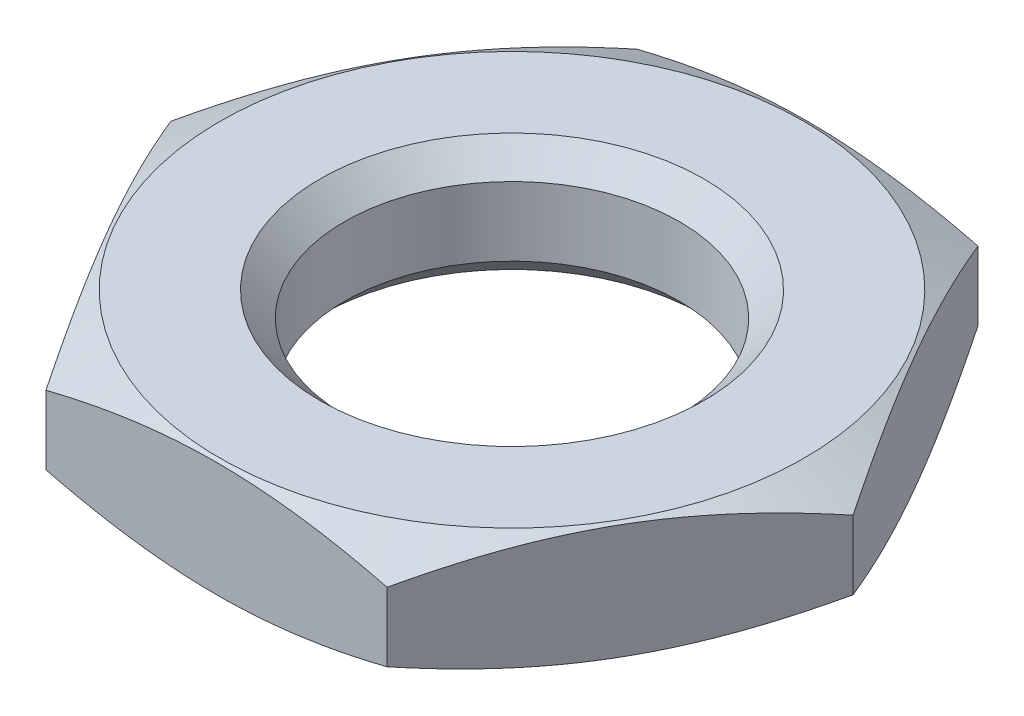
ISO-10303-21;
HEADER;
FILE_DESCRIPTION(('STEP AP214'),'2;1');
FILE_NAME('part.step','',(''),(''),'','','');
FILE_SCHEMA(('AUTOMOTIVE_DESIGN { 1 0 10303 214 1 1 1 1 }'));
ENDSEC;
DATA;
#1=APPLICATION_CONTEXT('core data for automotive mechanical design processes');
#2=APPLICATION_PROTOCOL_DEFINITION('international standard','automotive_design',2000,#1);
#3=PRODUCT_CONTEXT('',#1,'mechanical');
#4=PRODUCT('Part','Part','',(#3));
#5=PRODUCT_RELATED_PRODUCT_CATEGORY('part','',(#4));
#6=PRODUCT_DEFINITION_FORMATION('','',#4);
#7=PRODUCT_DEFINITION_CONTEXT('part definition',#1,'design');
#8=PRODUCT_DEFINITION('design','',#6,#7);
#9=PRODUCT_DEFINITION_SHAPE('','',#8);
#10=(LENGTH_UNIT() NAMED_UNIT(*) SI_UNIT(.MILLI.,.METRE.));
#11=(NAMED_UNIT(*) PLANE_ANGLE_UNIT() SI_UNIT($,.RADIAN.));
#12=(NAMED_UNIT(*) SI_UNIT($,.STERADIAN.) SOLID_ANGLE_UNIT());
#13=UNCERTAINTY_MEASURE_WITH_UNIT(LENGTH_MEASURE(1.E-05),#10,'distance_accuracy_value','');
#14=(GEOMETRIC_REPRESENTATION_CONTEXT(3) GLOBAL_UNCERTAINTY_ASSIGNED_CONTEXT((#13)) GLOBAL_UNIT_ASSIGNED_CONTEXT((#10,
#11,#12)) REPRESENTATION_CONTEXT('',''));
#15=CARTESIAN_POINT('',(0.,0.,0.));
#16=DIRECTION('',(0.,0.,1.));
#17=DIRECTION('',(1.,0.,0.));
#18=AXIS2_PLACEMENT_3D('',#15,#16,#17);
#19=CARTESIAN_POINT('',(0.,1.2,0.));
#20=DIRECTION('',(0.,1.,0.));
#21=DIRECTION('',(0.,0.,1.));
#22=AXIS2_PLACEMENT_3D('',#19,#20,#21);
#23=PLANE('',#22);
#24=CARTESIAN_POINT('',(0.,1.2,0.));
#25=DIRECTION('',(0.,1.,0.));
#26=DIRECTION('',(0.,0.,1.));
#27=AXIS2_PLACEMENT_3D('',#24,#25,#26);
#28=CIRCLE('',#27,3.9);
#29=CARTESIAN_POINT('',(0.,1.2,3.9));
#30=VERTEX_POINT('',#29);
#31=EDGE_CURVE('E142',#30,#30,#28,.F.);
#32=ORIENTED_EDGE('',*,*,#31,.T.);
#33=EDGE_LOOP('',(#32));
#34=FACE_BOUND('',#33,.T.);
#35=CARTESIAN_POINT('',(0.,1.2,0.));
#36=DIRECTION('',(0.,-1.,0.));
#37=DIRECTION('',(0.,0.,-1.));
#38=AXIS2_PLACEMENT_3D('',#35,#36,#37);
#39=CIRCLE('',#38,5.92820323027551);
#40=CARTESIAN_POINT('',(0.,1.2,-5.92820323027551));
#41=VERTEX_POINT('',#40);
#42=EDGE_CURVE('E250',#41,#41,#39,.T.);
#43=ORIENTED_EDGE('',*,*,#42,.F.);
#44=EDGE_LOOP('',(#43));
#45=FACE_BOUND('',#44,.T.);
#46=ADVANCED_FACE('F41',(#34,#45),#23,.T.);
#47=CARTESIAN_POINT('',(0.,-1.2,0.));
#48=DIRECTION('',(0.,1.,0.));
#49=DIRECTION('',(0.,0.,1.));
#50=AXIS2_PLACEMENT_3D('',#47,#48,#49);
#51=PLANE('',#50);
#52=CARTESIAN_POINT('',(0.,-1.2,0.));
#53=DIRECTION('',(0.,-1.,0.));
#54=DIRECTION('',(0.,0.,-1.));
#55=AXIS2_PLACEMENT_3D('',#52,#53,#54);
#56=CIRCLE('',#55,5.92820323027551);
#57=CARTESIAN_POINT('',(0.,-1.2,-5.92820323027551));
#58=VERTEX_POINT('',#57);
#59=EDGE_CURVE('E255',#58,#58,#56,.T.);
#60=ORIENTED_EDGE('',*,*,#59,.T.);
#61=EDGE_LOOP('',(#60));
#62=FACE_BOUND('',#61,.T.);
#63=CARTESIAN_POINT('',(0.,-1.2,0.));
#64=DIRECTION('',(0.,1.,0.));
#65=DIRECTION('',(0.,0.,1.));
#66=AXIS2_PLACEMENT_3D('',#63,#64,#65);
#67=CIRCLE('',#66,3.9);
#68=CARTESIAN_POINT('',(0.,-1.2,3.9));
#69=VERTEX_POINT('',#68);
#70=EDGE_CURVE('E123',#69,#69,#67,.T.);
#71=ORIENTED_EDGE('',*,*,#70,.T.);
#72=EDGE_LOOP('',(#71));
#73=FACE_BOUND('',#72,.T.);
#74=ADVANCED_FACE('F263',(#62,#73),#51,.F.);
#75=CARTESIAN_POINT('',(0.,1.2,0.));
#76=DIRECTION('',(0.,-1.,0.));
#77=DIRECTION('',(0.,0.,-1.));
#78=AXIS2_PLACEMENT_3D('',#75,#76,#77);
#79=CYLINDRICAL_SURFACE('',#78,3.4);
#80=CARTESIAN_POINT('',(0.,-0.7,0.));
#81=DIRECTION('',(0.,1.,0.));
#82=DIRECTION('',(0.,0.,1.));
#83=AXIS2_PLACEMENT_3D('',#80,#81,#82);
#84=CIRCLE('',#83,3.4);
#85=CARTESIAN_POINT('',(0.,-0.7,3.4));
#86=VERTEX_POINT('',#85);
#87=EDGE_CURVE('E138',#86,#86,#84,.F.);
#88=ORIENTED_EDGE('',*,*,#87,.T.);
#89=EDGE_LOOP('',(#88));
#90=FACE_BOUND('',#89,.T.);
#91=CARTESIAN_POINT('',(0.,0.699999999999999,0.));
#92=DIRECTION('',(0.,1.,0.));
#93=DIRECTION('',(0.,0.,1.));
#94=AXIS2_PLACEMENT_3D('',#91,#92,#93);
#95=CIRCLE('',#94,3.4);
#96=CARTESIAN_POINT('',(0.,0.699999999999999,3.4));
#97=VERTEX_POINT('',#96);
#98=EDGE_CURVE('E129',#97,#97,#95,.T.);
#99=ORIENTED_EDGE('',*,*,#98,.T.);
#100=EDGE_LOOP('',(#99));
#101=FACE_BOUND('',#100,.T.);
#102=ADVANCED_FACE('F161',(#90,#101),#79,.F.);
#103=CARTESIAN_POINT('',(0.,-1.2,0.));
#104=DIRECTION('',(0.,-1.,0.));
#105=DIRECTION('',(0.,0.,-1.));
#106=AXIS2_PLACEMENT_3D('',#103,#104,#105);
#107=CONICAL_SURFACE('',#106,3.9,0.785398163397446);
#108=ORIENTED_EDGE('',*,*,#87,.F.);
#109=EDGE_LOOP('',(#108));
#110=FACE_BOUND('',#109,.T.);
#111=ORIENTED_EDGE('',*,*,#70,.F.);
#112=EDGE_LOOP('',(#111));
#113=FACE_BOUND('',#112,.T.);
#114=ADVANCED_FACE('F268',(#110,#113),#107,.F.);
#115=CARTESIAN_POINT('',(0.,0.699999999999999,0.));
#116=DIRECTION('',(0.,1.,0.));
#117=DIRECTION('',(0.,0.,1.));
#118=AXIS2_PLACEMENT_3D('',#115,#116,#117);
#119=CONICAL_SURFACE('',#118,3.4,0.78539816339745);
#120=ORIENTED_EDGE('',*,*,#31,.F.);
#121=EDGE_LOOP('',(#120));
#122=FACE_BOUND('',#121,.T.);
#123=ORIENTED_EDGE('',*,*,#98,.F.);
#124=EDGE_LOOP('',(#123));
#125=FACE_BOUND('',#124,.T.);
#126=ADVANCED_FACE('F44',(#122,#125),#119,.F.);
#127=CARTESIAN_POINT('',(0.,-0.7,0.));
#128=DIRECTION('',(0.,1.,0.));
#129=DIRECTION('',(0.,0.,1.));
#130=AXIS2_PLACEMENT_3D('',#127,#128,#129);
#131=CONICAL_SURFACE('',#130,6.92820323027551,1.10714871779409);
#132=ORIENTED_EDGE('',*,*,#59,.F.);
#133=EDGE_LOOP('',(#132));
#134=FACE_BOUND('',#133,.T.);
#135=CARTESIAN_POINT('',(3.46398614508392,-0.699942263529729,6.0002));
#136=CARTESIAN_POINT('',(3.56162244786315,-0.748759243221176,5.83108896292318));
#137=CARTESIAN_POINT('',(3.65963913365284,-0.794679237030984,5.66131908314594));
#138=CARTESIAN_POINT('',(3.85645321453345,-0.879758268314605,5.32042709541575));
#139=CARTESIAN_POINT('',(3.95525098446174,-0.918913824047387,5.14930433822545));
#140=CARTESIAN_POINT('',(4.15369366564409,-0.989497059101713,4.80559153202743));
#141=CARTESIAN_POINT('',(4.25333961439506,-1.02091321349939,4.63299968602234));
#142=CARTESIAN_POINT('',(4.45321302199466,-1.07497419451463,4.28680878897791));
#143=CARTESIAN_POINT('',(4.55344037758671,-1.09762053298107,4.11320991678421));
#144=CARTESIAN_POINT('',(4.7520474389595,-1.1329465904084,3.76921239574458));
#145=CARTESIAN_POINT('',(4.85041751638308,-1.14584063008244,3.59883042370247));
#146=CARTESIAN_POINT('',(5.04736245260459,-1.16201752257452,3.25771178787339));
#147=CARTESIAN_POINT('',(5.14593732126247,-1.16529990136738,3.08697510700851));
#148=CARTESIAN_POINT('',(5.34294096418315,-1.16212617764838,2.74575478819375));
#149=CARTESIAN_POINT('',(5.44136978140928,-1.15568056561566,2.57527107582918));
#150=CARTESIAN_POINT('',(5.63794689713362,-1.13331863936492,2.23478952378927));
#151=CARTESIAN_POINT('',(5.73609521883008,-1.11740313254859,2.06479164393339));
#152=CARTESIAN_POINT('',(5.92576492800627,-1.0779593915224,1.73627407098341));
#153=CARTESIAN_POINT('',(6.01731488892831,-1.05497287488125,1.57770488723549));
#154=CARTESIAN_POINT('',(6.19990052050558,-1.00184306357037,1.26145729661161));
#155=CARTESIAN_POINT('',(6.29093613521713,-0.971699005177491,1.10377898663294));
#156=CARTESIAN_POINT('',(6.47342458540408,-0.904632551665562,0.787699719114637));
#157=CARTESIAN_POINT('',(6.56487075312607,-0.867638318144482,0.629310310462681));
#158=CARTESIAN_POINT('',(6.74709206818538,-0.787904072048137,0.313693734557949));
#159=CARTESIAN_POINT('',(6.83786750847436,-0.745166746166823,0.156466059898004));
#160=CARTESIAN_POINT('',(6.92831870032935,-0.699942263529729,-0.000200000000002981));
#161=B_SPLINE_CURVE_WITH_KNOTS('',3,(#135,#136,#137,#138,#139,#140,#141,#142,#143,#144,#145,
#146,#147,#148,#149,#150,#151,#152,#153,#154,#155,#156,#157,#158,#159,#160),.UNSPECIFIED.,.F.,
.F.,(4,2,2,2,2,2,2,2,2,2,2,2,4),(0.,0.603877187154902,1.20806427734942,1.81314571082424,
2.41812278642384,3.00938394511973,3.6006742629755,4.19132740011025,4.78193018546964,
5.33538966110918,5.88890821847391,6.44859919055235,7.00802923747474),.UNSPECIFIED.);
#162=CARTESIAN_POINT('',(3.46410161513776,-0.7,6.));
#163=VERTEX_POINT('',#162);
#164=CARTESIAN_POINT('',(6.92820323027551,-0.7,0.));
#165=VERTEX_POINT('',#164);
#166=EDGE_CURVE('E57',#163,#165,#161,.T.);
#167=ORIENTED_EDGE('',*,*,#166,.F.);
#168=CARTESIAN_POINT('',(-10.4105236098626,1.84378906777891,6.));
#169=CARTESIAN_POINT('',(-10.1167501837905,1.71655851512729,6.));
#170=CARTESIAN_POINT('',(-9.82250362945565,1.59040339163447,6.));
#171=CARTESIAN_POINT('',(-9.23279428985534,1.34088247274867,6.));
#172=CARTESIAN_POINT('',(-8.93733137784915,1.21751697719187,6.));
#173=CARTESIAN_POINT('',(-8.34404044199719,0.973854548708385,6.));
#174=CARTESIAN_POINT('',(-8.0462078852258,0.853568619026698,6.));
#175=CARTESIAN_POINT('',(-7.4488058376684,0.617404777751302,6.));
#176=CARTESIAN_POINT('',(-7.14923640297822,0.501526724700586,6.));
#177=CARTESIAN_POINT('',(-6.54814947750954,0.27546608855027,6.));
#178=CARTESIAN_POINT('',(-6.24663325328858,0.165280154271951,6.));
#179=CARTESIAN_POINT('',(-5.64100983374639,-0.0478327559760857,6.));
#180=CARTESIAN_POINT('',(-5.33690246704186,-0.150759247548418,6.));
#181=CARTESIAN_POINT('',(-4.72584675810012,-0.347071674826102,6.));
#182=CARTESIAN_POINT('',(-4.4189007967457,-0.440464932649821,6.));
#183=CARTESIAN_POINT('',(-3.80156617952493,-0.614910833013959,6.));
#184=CARTESIAN_POINT('',(-3.49117809053154,-0.695965476109179,6.));
#185=CARTESIAN_POINT('',(-2.76326569496856,-0.866331969641643,6.));
#186=CARTESIAN_POINT('',(-2.34423279594421,-0.949520984034137,6.));
#187=CARTESIAN_POINT('',(-1.7115549227716,-1.04604643279429,6.));
#188=CARTESIAN_POINT('',(-1.50003978477157,-1.07350780487205,6.));
#189=CARTESIAN_POINT('',(-1.0758980597364,-1.11801359038784,6.));
#190=CARTESIAN_POINT('',(-0.863271495665072,-1.13505821820091,6.));
#191=CARTESIAN_POINT('',(-0.437704422216154,-1.15798680726255,6.));
#192=CARTESIAN_POINT('',(-0.22476474616125,-1.16388607788367,6.));
#193=CARTESIAN_POINT('',(0.201124781346108,-1.16430550973797,6.));
#194=CARTESIAN_POINT('',(0.414074632723999,-1.15882574443061,6.));
#195=CARTESIAN_POINT('',(0.839455006139961,-1.13673013055748,6.));
#196=CARTESIAN_POINT('',(1.05188534783239,-1.12011084933067,6.));
#197=CARTESIAN_POINT('',(1.47565974071063,-1.07644325181762,6.));
#198=CARTESIAN_POINT('',(1.68700374785014,-1.04939451598856,6.));
#199=CARTESIAN_POINT('',(2.26427649135521,-0.962350779831864,6.));
#200=CARTESIAN_POINT('',(2.62877144234066,-0.892791670668626,6.));
#201=CARTESIAN_POINT('',(3.3527895483382,-0.731325650542965,6.));
#202=CARTESIAN_POINT('',(3.7123101856876,-0.639407831082056,6.));
#203=CARTESIAN_POINT('',(4.42790855353661,-0.438568504757574,6.));
#204=CARTESIAN_POINT('',(4.78396906070162,-0.329586517510285,6.));
#205=CARTESIAN_POINT('',(5.4919747128233,-0.0993284470541044,6.));
#206=CARTESIAN_POINT('',(5.843920548491,0.0219455387187662,6.));
#207=CARTESIAN_POINT('',(6.55242474656248,0.276399620010221,6.));
#208=CARTESIAN_POINT('',(6.90890831526848,0.409786439133047,6.));
#209=CARTESIAN_POINT('',(7.61917487370723,0.683597260902434,6.));
#210=CARTESIAN_POINT('',(7.97295767484324,0.824021749907911,6.));
#211=CARTESIAN_POINT('',(8.67501528558503,1.10880566039688,6.));
#212=CARTESIAN_POINT('',(9.02331048482593,1.25311498659746,6.));
#213=CARTESIAN_POINT('',(9.54444917061347,1.47255927104919,6.));
#214=CARTESIAN_POINT('',(9.71792630960836,1.54619608155919,6.));
#215=CARTESIAN_POINT('',(10.0644994760917,1.69435569860436,6.));
#216=CARTESIAN_POINT('',(10.2375955081293,1.76887849449499,6.));
#217=CARTESIAN_POINT('',(10.4105236098626,1.84378906777892,6.));
#218=B_SPLINE_CURVE_WITH_KNOTS('',3,(#168,#169,#170,#171,#172,#173,#174,#175,#176,#177,#178,
#179,#180,#181,#182,#183,#184,#185,#186,#187,#188,#189,#190,#191,#192,#193,#194,#195,#196,#197,
#198,#199,#200,#201,#202,#203,#204,#205,#206,#207,#208,#209,#210,#211,#212,#213,#214,#215,#216,
#217),.UNSPECIFIED.,.F.,.F.,(4,2,2,2,2,2,2,2,2,2,2,2,2,2,2,2,2,2,2,2,2,2,2,2,4),(0.,
0.960431806483115,1.92096635657044,2.88455483181606,3.84811235757127,4.81109597748536,
5.77414379327784,6.73644627279262,7.6985925602151,8.97869049135121,9.61834679402899,
10.2579899322313,10.896753809693,11.5355135635103,12.1744702427944,12.8134526278957,
13.9256633832952,15.0384178628114,16.1552094743925,17.271810842858,18.4135757822162,
19.5554197357034,20.6864092356477,21.2517835855559,21.8171511497078),.UNSPECIFIED.);
#219=CARTESIAN_POINT('',(-3.46410161513775,-0.7,6.00000000000001));
#220=VERTEX_POINT('',#219);
#221=EDGE_CURVE('E168',#220,#163,#218,.T.);
#222=ORIENTED_EDGE('',*,*,#221,.F.);
#223=CARTESIAN_POINT('',(-6.92831870032934,-0.699942263529732,-0.000199999999996664));
#224=CARTESIAN_POINT('',(-6.83068239755011,-0.748759243221178,0.168911037076821));
#225=CARTESIAN_POINT('',(-6.73266571176042,-0.794679237030987,0.338680916854063));
#226=CARTESIAN_POINT('',(-6.53585163087981,-0.879758268314608,0.679572904584251));
#227=CARTESIAN_POINT('',(-6.43705386095152,-0.91891382404739,0.850695661774551));
#228=CARTESIAN_POINT('',(-6.23861117976917,-0.989497059101715,1.19440846797257));
#229=CARTESIAN_POINT('',(-6.1389652310182,-1.02091321349939,1.36700031397767));
#230=CARTESIAN_POINT('',(-5.9390918234186,-1.07497419451463,1.71319121102209));
#231=CARTESIAN_POINT('',(-5.83886446782655,-1.09762053298107,1.88679008321579));
#232=CARTESIAN_POINT('',(-5.64025740645376,-1.13294659040841,2.23078760425543));
#233=CARTESIAN_POINT('',(-5.54188732903018,-1.14584063008244,2.40116957629753));
#234=CARTESIAN_POINT('',(-5.34494239280867,-1.16201752257452,2.74228821212662));
#235=CARTESIAN_POINT('',(-5.24636752415079,-1.16529990136739,2.91302489299149));
#236=CARTESIAN_POINT('',(-5.04936388123012,-1.16212617764838,3.25424521180625));
#237=CARTESIAN_POINT('',(-4.95093506400398,-1.15568056561566,3.42472892417082));
#238=CARTESIAN_POINT('',(-4.75435794827964,-1.13331863936492,3.76521047621072));
#239=CARTESIAN_POINT('',(-4.65620962658318,-1.11740313254859,3.93520835606661));
#240=CARTESIAN_POINT('',(-4.46653991740699,-1.0779593915224,4.26372592901659));
#241=CARTESIAN_POINT('',(-4.37498995648495,-1.05497287488125,4.42229511276451));
#242=CARTESIAN_POINT('',(-4.19240432490768,-1.00184306357037,4.73854270338839));
#243=CARTESIAN_POINT('',(-4.10136871019613,-0.971699005177493,4.89622101336706));
#244=CARTESIAN_POINT('',(-3.91888026000918,-0.904632551665563,5.21230028088536));
#245=CARTESIAN_POINT('',(-3.82743409228719,-0.867638318144484,5.37068968953732));
#246=CARTESIAN_POINT('',(-3.64521277722788,-0.787904072048138,5.68630626544205));
#247=CARTESIAN_POINT('',(-3.5544373369389,-0.745166746166824,5.843533940102));
#248=CARTESIAN_POINT('',(-3.46398614508391,-0.69994226352973,6.0002));
#249=B_SPLINE_CURVE_WITH_KNOTS('',3,(#223,#224,#225,#226,#227,#228,#229,#230,#231,#232,#233,
#234,#235,#236,#237,#238,#239,#240,#241,#242,#243,#244,#245,#246,#247,#248),.UNSPECIFIED.,.F.,
.F.,(4,2,2,2,2,2,2,2,2,2,2,2,4),(0.,0.603877187154901,1.20806427734942,1.81314571082424,
2.41812278642383,3.00938394511972,3.6006742629755,4.19132740011024,4.78193018546963,
5.33538966110917,5.88890821847391,6.44859919055235,7.00802923747474),.UNSPECIFIED.);
#250=CARTESIAN_POINT('',(-6.92820323027551,-0.7,0.));
#251=VERTEX_POINT('',#250);
#252=EDGE_CURVE('E176',#251,#220,#249,.T.);
#253=ORIENTED_EDGE('',*,*,#252,.F.);
#254=CARTESIAN_POINT('',(-3.46398614508392,-0.699942263529731,-6.0002));
#255=CARTESIAN_POINT('',(-3.56162244786315,-0.748759243221177,-5.83108896292318));
#256=CARTESIAN_POINT('',(-3.65963913365284,-0.794679237030986,-5.66131908314594));
#257=CARTESIAN_POINT('',(-3.85645321453345,-0.879758268314607,-5.32042709541575));
#258=CARTESIAN_POINT('',(-3.95525098446174,-0.91891382404739,-5.14930433822545));
#259=CARTESIAN_POINT('',(-4.15369366564409,-0.989497059101715,-4.80559153202743));
#260=CARTESIAN_POINT('',(-4.25333961439506,-1.02091321349939,-4.63299968602233));
#261=CARTESIAN_POINT('',(-4.45321302199466,-1.07497419451463,-4.2868087889779));
#262=CARTESIAN_POINT('',(-4.55344037758671,-1.09762053298107,-4.11320991678421));
#263=CARTESIAN_POINT('',(-4.7520474389595,-1.13294659040841,-3.76921239574457));
#264=CARTESIAN_POINT('',(-4.85041751638307,-1.14584063008244,-3.59883042370246));
#265=CARTESIAN_POINT('',(-5.04736245260459,-1.16201752257452,-3.25771178787338));
#266=CARTESIAN_POINT('',(-5.14593732126247,-1.16529990136739,-3.08697510700851));
#267=CARTESIAN_POINT('',(-5.34294096418314,-1.16212617764838,-2.74575478819374));
#268=CARTESIAN_POINT('',(-5.44136978140928,-1.15568056561566,-2.57527107582917));
#269=CARTESIAN_POINT('',(-5.63794689713361,-1.13331863936492,-2.23478952378927));
#270=CARTESIAN_POINT('',(-5.73609521883008,-1.11740313254859,-2.06479164393338));
#271=CARTESIAN_POINT('',(-5.92576492800627,-1.07795939152241,-1.73627407098341));
#272=CARTESIAN_POINT('',(-6.01731488892831,-1.05497287488125,-1.57770488723549));
#273=CARTESIAN_POINT('',(-6.19990052050558,-1.00184306357037,-1.26145729661161));
#274=CARTESIAN_POINT('',(-6.29093613521712,-0.971699005177493,-1.10377898663294));
#275=CARTESIAN_POINT('',(-6.47342458540408,-0.904632551665564,-0.787699719114635));
#276=CARTESIAN_POINT('',(-6.56487075312607,-0.867638318144485,-0.62931031046268));
#277=CARTESIAN_POINT('',(-6.74709206818537,-0.78790407204814,-0.313693734557948));
#278=CARTESIAN_POINT('',(-6.83786750847435,-0.745166746166825,-0.156466059898003));
#279=CARTESIAN_POINT('',(-6.92831870032934,-0.699942263529732,0.000200000000003891));
#280=B_SPLINE_CURVE_WITH_KNOTS('',3,(#254,#255,#256,#257,#258,#259,#260,#261,#262,#263,#264,
#265,#266,#267,#268,#269,#270,#271,#272,#273,#274,#275,#276,#277,#278,#279),.UNSPECIFIED.,.F.,
.F.,(4,2,2,2,2,2,2,2,2,2,2,2,4),(0.,0.603877187154902,1.20806427734942,1.81314571082424,
2.41812278642384,3.00938394511973,3.6006742629755,4.19132740011025,4.78193018546964,
5.33538966110918,5.88890821847391,6.44859919055235,7.00802923747473),.UNSPECIFIED.);
#281=CARTESIAN_POINT('',(-3.46410161513775,-0.7,-6.));
#282=VERTEX_POINT('',#281);
#283=EDGE_CURVE('E102',#282,#251,#280,.T.);
#284=ORIENTED_EDGE('',*,*,#283,.F.);
#285=CARTESIAN_POINT('',(10.4105236098627,1.84378906777892,-6.));
#286=CARTESIAN_POINT('',(10.1167501837905,1.7165585151273,-6.));
#287=CARTESIAN_POINT('',(9.82250362945566,1.59040339163448,-6.));
#288=CARTESIAN_POINT('',(9.23279428985535,1.34088247274867,-6.));
#289=CARTESIAN_POINT('',(8.93733137784916,1.21751697719187,-6.));
#290=CARTESIAN_POINT('',(8.3440404419972,0.973854548708388,-6.));
#291=CARTESIAN_POINT('',(8.04620788522581,0.853568619026702,-6.));
#292=CARTESIAN_POINT('',(7.44880583766842,0.617404777751306,-6.));
#293=CARTESIAN_POINT('',(7.14923640297824,0.50152672470059,-6.));
#294=CARTESIAN_POINT('',(6.54814947750956,0.275466088550272,-6.));
#295=CARTESIAN_POINT('',(6.24663325328859,0.165280154271953,-6.));
#296=CARTESIAN_POINT('',(5.6410098337464,-0.0478327559760835,-6.));
#297=CARTESIAN_POINT('',(5.33690246704187,-0.150759247548416,-6.));
#298=CARTESIAN_POINT('',(4.72584675810013,-0.3470716748261,-6.));
#299=CARTESIAN_POINT('',(4.41890079674571,-0.44046493264982,-6.));
#300=CARTESIAN_POINT('',(3.80156617952493,-0.614910833013959,-6.));
#301=CARTESIAN_POINT('',(3.49117809053154,-0.695965476109179,-6.));
#302=CARTESIAN_POINT('',(2.76326569496857,-0.866331969641643,-6.));
#303=CARTESIAN_POINT('',(2.34423279594422,-0.949520984034137,-6.));
#304=CARTESIAN_POINT('',(1.71155492277161,-1.04604643279429,-6.));
#305=CARTESIAN_POINT('',(1.50003978477158,-1.07350780487205,-6.));
#306=CARTESIAN_POINT('',(1.0758980597364,-1.11801359038784,-6.));
#307=CARTESIAN_POINT('',(0.863271495665081,-1.13505821820091,-6.));
#308=CARTESIAN_POINT('',(0.437704422216163,-1.15798680726255,-6.));
#309=CARTESIAN_POINT('',(0.224764746161258,-1.16388607788367,-6.));
#310=CARTESIAN_POINT('',(-0.2011247813461,-1.16430550973797,-6.));
#311=CARTESIAN_POINT('',(-0.414074632723991,-1.15882574443062,-6.));
#312=CARTESIAN_POINT('',(-0.839455006139953,-1.13673013055748,-6.));
#313=CARTESIAN_POINT('',(-1.05188534783239,-1.12011084933067,-6.));
#314=CARTESIAN_POINT('',(-1.47565974071062,-1.07644325181762,-6.));
#315=CARTESIAN_POINT('',(-1.68700374785013,-1.04939451598857,-6.));
#316=CARTESIAN_POINT('',(-2.26427649135521,-0.962350779831867,-6.));
#317=CARTESIAN_POINT('',(-2.62877144234066,-0.892791670668629,-6.));
#318=CARTESIAN_POINT('',(-3.35278954833819,-0.731325650542967,-6.));
#319=CARTESIAN_POINT('',(-3.7123101856876,-0.639407831082059,-6.));
#320=CARTESIAN_POINT('',(-4.42790855353661,-0.438568504757577,-6.));
#321=CARTESIAN_POINT('',(-4.78396906070162,-0.329586517510288,-6.));
#322=CARTESIAN_POINT('',(-5.4919747128233,-0.0993284470541067,-6.));
#323=CARTESIAN_POINT('',(-5.843920548491,0.0219455387187645,-6.));
#324=CARTESIAN_POINT('',(-6.55242474656248,0.27639962001022,-6.));
#325=CARTESIAN_POINT('',(-6.90890831526848,0.409786439133046,-6.));
#326=CARTESIAN_POINT('',(-7.61917487370724,0.683597260902433,-6.));
#327=CARTESIAN_POINT('',(-7.97295767484324,0.824021749907911,-6.));
#328=CARTESIAN_POINT('',(-8.67501528558503,1.10880566039688,-6.));
#329=CARTESIAN_POINT('',(-9.02331048482593,1.25311498659746,-6.));
#330=CARTESIAN_POINT('',(-9.54444917061348,1.47255927104919,-6.));
#331=CARTESIAN_POINT('',(-9.71792630960836,1.54619608155919,-6.));
#332=CARTESIAN_POINT('',(-10.0644994760917,1.69435569860436,-6.));
#333=CARTESIAN_POINT('',(-10.2375955081293,1.76887849449499,-6.));
#334=CARTESIAN_POINT('',(-10.4105236098627,1.84378906777892,-6.));
#335=B_SPLINE_CURVE_WITH_KNOTS('',3,(#285,#286,#287,#288,#289,#290,#291,#292,#293,#294,#295,
#296,#297,#298,#299,#300,#301,#302,#303,#304,#305,#306,#307,#308,#309,#310,#311,#312,#313,#314,
#315,#316,#317,#318,#319,#320,#321,#322,#323,#324,#325,#326,#327,#328,#329,#330,#331,#332,#333,
#334),.UNSPECIFIED.,.F.,.F.,(4,2,2,2,2,2,2,2,2,2,2,2,2,2,2,2,2,2,2,2,2,2,2,2,4),(0.,
0.960431806483117,1.92096635657044,2.88455483181606,3.84811235757127,4.81109597748536,
5.77414379327785,6.73644627279262,7.69859256021511,8.97869049135122,9.61834679402899,
10.2579899322314,10.8967538096931,11.5355135635103,12.1744702427944,12.8134526278957,
13.9256633832952,15.0384178628115,16.1552094743925,17.271810842858,18.4135757822162,
19.5554197357034,20.6864092356477,21.2517835855559,21.8171511497079),.UNSPECIFIED.);
#336=CARTESIAN_POINT('',(3.46410161513776,-0.7,-6.));
#337=VERTEX_POINT('',#336);
#338=EDGE_CURVE('E99',#337,#282,#335,.T.);
#339=ORIENTED_EDGE('',*,*,#338,.F.);
#340=CARTESIAN_POINT('',(6.92831870032935,-0.699942263529729,0.000199999999997339));
#341=CARTESIAN_POINT('',(6.83068239755011,-0.748759243221176,-0.168911037076821));
#342=CARTESIAN_POINT('',(6.73266571176043,-0.794679237030985,-0.338680916854063));
#343=CARTESIAN_POINT('',(6.53585163087982,-0.879758268314605,-0.679572904584252));
#344=CARTESIAN_POINT('',(6.43705386095153,-0.918913824047388,-0.850695661774552));
#345=CARTESIAN_POINT('',(6.23861117976918,-0.989497059101713,-1.19440846797257));
#346=CARTESIAN_POINT('',(6.1389652310182,-1.02091321349939,-1.36700031397767));
#347=CARTESIAN_POINT('',(5.9390918234186,-1.07497419451463,-1.7131912110221));
#348=CARTESIAN_POINT('',(5.83886446782656,-1.09762053298107,-1.88679008321579));
#349=CARTESIAN_POINT('',(5.64025740645376,-1.13294659040841,-2.23078760425543));
#350=CARTESIAN_POINT('',(5.54188732903019,-1.14584063008244,-2.40116957629754));
#351=CARTESIAN_POINT('',(5.34494239280867,-1.16201752257452,-2.74228821212662));
#352=CARTESIAN_POINT('',(5.24636752415079,-1.16529990136738,-2.91302489299149));
#353=CARTESIAN_POINT('',(5.04936388123012,-1.16212617764838,-3.25424521180626));
#354=CARTESIAN_POINT('',(4.95093506400398,-1.15568056561566,-3.42472892417083));
#355=CARTESIAN_POINT('',(4.75435794827965,-1.13331863936492,-3.76521047621073));
#356=CARTESIAN_POINT('',(4.65620962658318,-1.11740313254859,-3.93520835606662));
#357=CARTESIAN_POINT('',(4.46653991740699,-1.0779593915224,-4.2637259290166));
#358=CARTESIAN_POINT('',(4.37498995648495,-1.05497287488125,-4.42229511276451));
#359=CARTESIAN_POINT('',(4.19240432490768,-1.00184306357037,-4.73854270338839));
#360=CARTESIAN_POINT('',(4.10136871019613,-0.971699005177491,-4.89622101336706));
#361=CARTESIAN_POINT('',(3.91888026000918,-0.904632551665562,-5.21230028088536));
#362=CARTESIAN_POINT('',(3.82743409228719,-0.867638318144483,-5.37068968953732));
#363=CARTESIAN_POINT('',(3.64521277722789,-0.787904072048138,-5.68630626544205));
#364=CARTESIAN_POINT('',(3.55443733693891,-0.745166746166823,-5.84353394010199));
#365=CARTESIAN_POINT('',(3.46398614508392,-0.69994226352973,-6.0002));
#366=B_SPLINE_CURVE_WITH_KNOTS('',3,(#340,#341,#342,#343,#344,#345,#346,#347,#348,#349,#350,
#351,#352,#353,#354,#355,#356,#357,#358,#359,#360,#361,#362,#363,#364,#365),.UNSPECIFIED.,.F.,
.F.,(4,2,2,2,2,2,2,2,2,2,2,2,4),(0.,0.603877187154902,1.20806427734942,1.81314571082425,
2.41812278642384,3.00938394511973,3.6006742629755,4.19132740011025,4.78193018546964,
5.33538966110918,5.88890821847391,6.44859919055234,7.00802923747473),.UNSPECIFIED.);
#367=EDGE_CURVE('E71',#165,#337,#366,.T.);
#368=ORIENTED_EDGE('',*,*,#367,.F.);
#369=EDGE_LOOP('',(#167,#222,#253,#284,#339,#368));
#370=FACE_BOUND('',#369,.T.);
#371=ADVANCED_FACE('F100',(#134,#370),#131,.T.);
#372=CARTESIAN_POINT('',(0.,1.2,0.));
#373=DIRECTION('',(0.,-1.,0.));
#374=DIRECTION('',(0.,0.,-1.));
#375=AXIS2_PLACEMENT_3D('',#372,#373,#374);
#376=CONICAL_SURFACE('',#375,5.92820323027551,1.10714871779409);
#377=ORIENTED_EDGE('',*,*,#42,.T.);
#378=EDGE_LOOP('',(#377));
#379=FACE_BOUND('',#378,.T.);
#380=CARTESIAN_POINT('',(-10.4105236098627,-1.84378906777892,-6.));
#381=CARTESIAN_POINT('',(-10.1167501837905,-1.7165585151273,-6.));
#382=CARTESIAN_POINT('',(-9.82250362945566,-1.59040339163448,-6.));
#383=CARTESIAN_POINT('',(-9.23279428985535,-1.34088247274867,-6.));
#384=CARTESIAN_POINT('',(-8.93733137784916,-1.21751697719187,-6.));
#385=CARTESIAN_POINT('',(-8.3440404419972,-0.973854548708387,-6.));
#386=CARTESIAN_POINT('',(-8.04620788522581,-0.8535686190267,-6.));
#387=CARTESIAN_POINT('',(-7.44880583766841,-0.617404777751304,-6.));
#388=CARTESIAN_POINT('',(-7.14923640297823,-0.501526724700589,-6.));
#389=CARTESIAN_POINT('',(-6.54814947750956,-0.275466088550272,-6.));
#390=CARTESIAN_POINT('',(-6.24663325328859,-0.165280154271954,-6.));
#391=CARTESIAN_POINT('',(-5.6410098337464,0.0478327559760836,-6.));
#392=CARTESIAN_POINT('',(-5.33690246704187,0.150759247548416,-6.));
#393=CARTESIAN_POINT('',(-4.72584675810013,0.3470716748261,-6.));
#394=CARTESIAN_POINT('',(-4.41890079674571,0.44046493264982,-6.));
#395=CARTESIAN_POINT('',(-3.80156617952493,0.614910833013958,-6.));
#396=CARTESIAN_POINT('',(-3.49117809053155,0.695965476109178,-6.));
#397=CARTESIAN_POINT('',(-2.76326569496857,0.866331969641643,-6.));
#398=CARTESIAN_POINT('',(-2.34423279594422,0.949520984034137,-6.));
#399=CARTESIAN_POINT('',(-1.71155492277161,1.04604643279429,-6.));
#400=CARTESIAN_POINT('',(-1.50003978477158,1.07350780487205,-6.));
#401=CARTESIAN_POINT('',(-1.07589805973641,1.11801359038784,-6.));
#402=CARTESIAN_POINT('',(-0.863271495665082,1.13505821820091,-6.));
#403=CARTESIAN_POINT('',(-0.437704422216164,1.15798680726255,-6.));
#404=CARTESIAN_POINT('',(-0.224764746161259,1.16388607788367,-6.));
#405=CARTESIAN_POINT('',(0.201124781346099,1.16430550973797,-6.));
#406=CARTESIAN_POINT('',(0.41407463272399,1.15882574443062,-6.));
#407=CARTESIAN_POINT('',(0.839455006139953,1.13673013055748,-6.));
#408=CARTESIAN_POINT('',(1.05188534783238,1.12011084933067,-6.));
#409=CARTESIAN_POINT('',(1.47565974071062,1.07644325181762,-6.));
#410=CARTESIAN_POINT('',(1.68700374785013,1.04939451598857,-6.));
#411=CARTESIAN_POINT('',(2.26427649135521,0.962350779831867,-6.));
#412=CARTESIAN_POINT('',(2.62877144234066,0.892791670668629,-6.));
#413=CARTESIAN_POINT('',(3.35278954833819,0.731325650542967,-6.));
#414=CARTESIAN_POINT('',(3.7123101856876,0.639407831082059,-6.));
#415=CARTESIAN_POINT('',(4.42790855353661,0.438568504757576,-6.));
#416=CARTESIAN_POINT('',(4.78396906070162,0.329586517510287,-6.));
#417=CARTESIAN_POINT('',(5.4919747128233,0.0993284470541057,-6.));
#418=CARTESIAN_POINT('',(5.843920548491,-0.0219455387187654,-6.));
#419=CARTESIAN_POINT('',(6.55242474656248,-0.276399620010221,-6.));
#420=CARTESIAN_POINT('',(6.90890831526848,-0.409786439133047,-6.));
#421=CARTESIAN_POINT('',(7.61917487370724,-0.683597260902434,-6.));
#422=CARTESIAN_POINT('',(7.97295767484324,-0.824021749907911,-6.));
#423=CARTESIAN_POINT('',(8.67501528558503,-1.10880566039688,-6.));
#424=CARTESIAN_POINT('',(9.02331048482593,-1.25311498659746,-6.));
#425=CARTESIAN_POINT('',(9.54444917061348,-1.47255927104919,-6.));
#426=CARTESIAN_POINT('',(9.71792630960836,-1.54619608155919,-6.));
#427=CARTESIAN_POINT('',(10.0644994760917,-1.69435569860436,-6.));
#428=CARTESIAN_POINT('',(10.2375955081293,-1.76887849449499,-6.));
#429=CARTESIAN_POINT('',(10.4105236098627,-1.84378906777892,-6.));
#430=B_SPLINE_CURVE_WITH_KNOTS('',3,(#380,#381,#382,#383,#384,#385,#386,#387,#388,#389,#390,
#391,#392,#393,#394,#395,#396,#397,#398,#399,#400,#401,#402,#403,#404,#405,#406,#407,#408,#409,
#410,#411,#412,#413,#414,#415,#416,#417,#418,#419,#420,#421,#422,#423,#424,#425,#426,#427,#428,
#429),.UNSPECIFIED.,.F.,.F.,(4,2,2,2,2,2,2,2,2,2,2,2,2,2,2,2,2,2,2,2,2,2,2,2,4),(0.,
0.960431806483116,1.92096635657044,2.88455483181607,3.84811235757127,4.81109597748536,
5.77414379327785,6.73644627279262,7.6985925602151,8.97869049135121,9.61834679402899,
10.2579899322314,10.8967538096931,11.5355135635103,12.1744702427944,12.8134526278957,
13.9256633832952,15.0384178628115,16.1552094743925,17.271810842858,18.4135757822162,
19.5554197357034,20.6864092356477,21.2517835855559,21.8171511497079),.UNSPECIFIED.);
#431=CARTESIAN_POINT('',(-3.46410161513775,0.7,-6.));
#432=VERTEX_POINT('',#431);
#433=CARTESIAN_POINT('',(3.46410161513776,0.7,-6.));
#434=VERTEX_POINT('',#433);
#435=EDGE_CURVE('E121',#432,#434,#430,.T.);
#436=ORIENTED_EDGE('',*,*,#435,.F.);
#437=CARTESIAN_POINT('',(-6.92831870032934,0.699942263529732,0.000200000000003609));
#438=CARTESIAN_POINT('',(-6.83068239755011,0.748759243221178,-0.168911037076814));
#439=CARTESIAN_POINT('',(-6.73266571176042,0.794679237030987,-0.338680916854056));
#440=CARTESIAN_POINT('',(-6.53585163087981,0.879758268314607,-0.679572904584245));
#441=CARTESIAN_POINT('',(-6.43705386095152,0.91891382404739,-0.850695661774545));
#442=CARTESIAN_POINT('',(-6.23861117976918,0.989497059101715,-1.19440846797257));
#443=CARTESIAN_POINT('',(-6.1389652310182,1.02091321349939,-1.36700031397766));
#444=CARTESIAN_POINT('',(-5.9390918234186,1.07497419451463,-1.71319121102209));
#445=CARTESIAN_POINT('',(-5.83886446782655,1.09762053298107,-1.88679008321579));
#446=CARTESIAN_POINT('',(-5.64025740645376,1.13294659040841,-2.23078760425542));
#447=CARTESIAN_POINT('',(-5.54188732903019,1.14584063008244,-2.40116957629753));
#448=CARTESIAN_POINT('',(-5.34494239280867,1.16201752257452,-2.74228821212661));
#449=CARTESIAN_POINT('',(-5.24636752415079,1.16529990136739,-2.91302489299148));
#450=CARTESIAN_POINT('',(-5.04936388123012,1.16212617764838,-3.25424521180625));
#451=CARTESIAN_POINT('',(-4.95093506400398,1.15568056561566,-3.42472892417082));
#452=CARTESIAN_POINT('',(-4.75435794827965,1.13331863936492,-3.76521047621072));
#453=CARTESIAN_POINT('',(-4.65620962658318,1.11740313254859,-3.93520835606661));
#454=CARTESIAN_POINT('',(-4.46653991740699,1.0779593915224,-4.26372592901659));
#455=CARTESIAN_POINT('',(-4.37498995648495,1.05497287488125,-4.42229511276451));
#456=CARTESIAN_POINT('',(-4.19240432490768,1.00184306357037,-4.73854270338839));
#457=CARTESIAN_POINT('',(-4.10136871019613,0.971699005177492,-4.89622101336706));
#458=CARTESIAN_POINT('',(-3.91888026000918,0.904632551665563,-5.21230028088536));
#459=CARTESIAN_POINT('',(-3.82743409228719,0.867638318144484,-5.37068968953731));
#460=CARTESIAN_POINT('',(-3.64521277722789,0.787904072048138,-5.68630626544205));
#461=CARTESIAN_POINT('',(-3.55443733693891,0.745166746166823,-5.84353394010199));
#462=CARTESIAN_POINT('',(-3.46398614508392,0.69994226352973,-6.0002));
#463=B_SPLINE_CURVE_WITH_KNOTS('',3,(#437,#438,#439,#440,#441,#442,#443,#444,#445,#446,#447,
#448,#449,#450,#451,#452,#453,#454,#455,#456,#457,#458,#459,#460,#461,#462),.UNSPECIFIED.,.F.,
.F.,(4,2,2,2,2,2,2,2,2,2,2,2,4),(0.,0.6038771871549,1.20806427734942,1.81314571082424,
2.41812278642384,3.00938394511972,3.6006742629755,4.19132740011024,4.78193018546964,
5.33538966110917,5.88890821847391,6.44859919055234,7.00802923747473),.UNSPECIFIED.);
#464=CARTESIAN_POINT('',(-6.92820323027551,0.7,0.));
#465=VERTEX_POINT('',#464);
#466=EDGE_CURVE('E214',#465,#432,#463,.T.);
#467=ORIENTED_EDGE('',*,*,#466,.F.);
#468=CARTESIAN_POINT('',(-3.46398614508391,0.69994226352973,6.0002));
#469=CARTESIAN_POINT('',(-3.56162244786315,0.748759243221177,5.83108896292319));
#470=CARTESIAN_POINT('',(-3.65963913365283,0.794679237030986,5.66131908314594));
#471=CARTESIAN_POINT('',(-3.85645321453344,0.879758268314607,5.32042709541575));
#472=CARTESIAN_POINT('',(-3.95525098446173,0.918913824047389,5.14930433822545));
#473=CARTESIAN_POINT('',(-4.15369366564408,0.989497059101715,4.80559153202743));
#474=CARTESIAN_POINT('',(-4.25333961439506,1.02091321349939,4.63299968602234));
#475=CARTESIAN_POINT('',(-4.45321302199466,1.07497419451463,4.28680878897791));
#476=CARTESIAN_POINT('',(-4.5534403775867,1.09762053298107,4.11320991678421));
#477=CARTESIAN_POINT('',(-4.7520474389595,1.13294659040841,3.76921239574458));
#478=CARTESIAN_POINT('',(-4.85041751638307,1.14584063008244,3.59883042370247));
#479=CARTESIAN_POINT('',(-5.04736245260459,1.16201752257452,3.25771178787339));
#480=CARTESIAN_POINT('',(-5.14593732126247,1.16529990136739,3.08697510700852));
#481=CARTESIAN_POINT('',(-5.34294096418314,1.16212617764838,2.74575478819375));
#482=CARTESIAN_POINT('',(-5.44136978140927,1.15568056561566,2.57527107582918));
#483=CARTESIAN_POINT('',(-5.63794689713361,1.13331863936492,2.23478952378928));
#484=CARTESIAN_POINT('',(-5.73609521883007,1.11740313254859,2.06479164393339));
#485=CARTESIAN_POINT('',(-5.92576492800627,1.07795939152241,1.73627407098341));
#486=CARTESIAN_POINT('',(-6.01731488892831,1.05497287488125,1.57770488723549));
#487=CARTESIAN_POINT('',(-6.19990052050558,1.00184306357037,1.26145729661161));
#488=CARTESIAN_POINT('',(-6.29093613521712,0.971699005177493,1.10377898663294));
#489=CARTESIAN_POINT('',(-6.47342458540408,0.904632551665564,0.787699719114642));
#490=CARTESIAN_POINT('',(-6.56487075312607,0.867638318144485,0.629310310462687));
#491=CARTESIAN_POINT('',(-6.74709206818537,0.787904072048139,0.313693734557955));
#492=CARTESIAN_POINT('',(-6.83786750847435,0.745166746166825,0.15646605989801));
#493=CARTESIAN_POINT('',(-6.92831870032934,0.699942263529732,-0.000199999999996908));
#494=B_SPLINE_CURVE_WITH_KNOTS('',3,(#468,#469,#470,#471,#472,#473,#474,#475,#476,#477,#478,
#479,#480,#481,#482,#483,#484,#485,#486,#487,#488,#489,#490,#491,#492,#493),.UNSPECIFIED.,.F.,
.F.,(4,2,2,2,2,2,2,2,2,2,2,2,4),(0.,0.603877187154902,1.20806427734942,1.81314571082425,
2.41812278642384,3.00938394511973,3.6006742629755,4.19132740011025,4.78193018546964,
5.33538966110918,5.88890821847391,6.44859919055235,7.00802923747474),.UNSPECIFIED.);
#495=CARTESIAN_POINT('',(-3.46410161513775,0.7,6.));
#496=VERTEX_POINT('',#495);
#497=EDGE_CURVE('E243',#496,#465,#494,.T.);
#498=ORIENTED_EDGE('',*,*,#497,.F.);
#499=CARTESIAN_POINT('',(10.4105236098627,-1.84378906777892,6.));
#500=CARTESIAN_POINT('',(10.1167501837905,-1.7165585151273,6.));
#501=CARTESIAN_POINT('',(9.82250362945566,-1.59040339163448,6.));
#502=CARTESIAN_POINT('',(9.23279428985535,-1.34088247274867,6.));
#503=CARTESIAN_POINT('',(8.93733137784916,-1.21751697719187,6.));
#504=CARTESIAN_POINT('',(8.3440404419972,-0.973854548708386,6.));
#505=CARTESIAN_POINT('',(8.04620788522581,-0.8535686190267,6.));
#506=CARTESIAN_POINT('',(7.44880583766841,-0.617404777751304,6.));
#507=CARTESIAN_POINT('',(7.14923640297823,-0.501526724700588,6.));
#508=CARTESIAN_POINT('',(6.54814947750955,-0.275466088550271,6.));
#509=CARTESIAN_POINT('',(6.24663325328859,-0.165280154271952,6.));
#510=CARTESIAN_POINT('',(5.6410098337464,0.0478327559760844,6.));
#511=CARTESIAN_POINT('',(5.33690246704186,0.150759247548416,6.));
#512=CARTESIAN_POINT('',(4.72584675810013,0.3470716748261,6.));
#513=CARTESIAN_POINT('',(4.4189007967457,0.44046493264982,6.));
#514=CARTESIAN_POINT('',(3.80156617952493,0.614910833013958,6.));
#515=CARTESIAN_POINT('',(3.49117809053154,0.695965476109179,6.));
#516=CARTESIAN_POINT('',(2.76326569496857,0.866331969641642,6.));
#517=CARTESIAN_POINT('',(2.34423279594422,0.949520984034136,6.));
#518=CARTESIAN_POINT('',(1.71155492277161,1.04604643279428,6.));
#519=CARTESIAN_POINT('',(1.50003978477157,1.07350780487205,6.));
#520=CARTESIAN_POINT('',(1.0758980597364,1.11801359038784,6.));
#521=CARTESIAN_POINT('',(0.863271495665078,1.13505821820091,6.));
#522=CARTESIAN_POINT('',(0.43770442221616,1.15798680726255,6.));
#523=CARTESIAN_POINT('',(0.224764746161255,1.16388607788367,6.));
#524=CARTESIAN_POINT('',(-0.201124781346103,1.16430550973797,6.));
#525=CARTESIAN_POINT('',(-0.414074632723994,1.15882574443061,6.));
#526=CARTESIAN_POINT('',(-0.839455006139956,1.13673013055748,6.));
#527=CARTESIAN_POINT('',(-1.05188534783239,1.12011084933067,6.));
#528=CARTESIAN_POINT('',(-1.47565974071063,1.07644325181762,6.));
#529=CARTESIAN_POINT('',(-1.68700374785014,1.04939451598856,6.));
#530=CARTESIAN_POINT('',(-2.26427649135521,0.962350779831865,6.));
#531=CARTESIAN_POINT('',(-2.62877144234066,0.892791670668627,6.));
#532=CARTESIAN_POINT('',(-3.35278954833819,0.731325650542965,6.));
#533=CARTESIAN_POINT('',(-3.7123101856876,0.639407831082057,6.));
#534=CARTESIAN_POINT('',(-4.42790855353661,0.438568504757574,6.));
#535=CARTESIAN_POINT('',(-4.78396906070162,0.329586517510286,6.));
#536=CARTESIAN_POINT('',(-5.4919747128233,0.0993284470541049,6.));
#537=CARTESIAN_POINT('',(-5.843920548491,-0.0219455387187663,6.));
#538=CARTESIAN_POINT('',(-6.55242474656248,-0.276399620010221,6.));
#539=CARTESIAN_POINT('',(-6.90890831526847,-0.409786439133047,6.));
#540=CARTESIAN_POINT('',(-7.61917487370723,-0.683597260902432,6.));
#541=CARTESIAN_POINT('',(-7.97295767484324,-0.824021749907909,6.));
#542=CARTESIAN_POINT('',(-8.67501528558502,-1.10880566039688,6.));
#543=CARTESIAN_POINT('',(-9.02331048482592,-1.25311498659746,6.));
#544=CARTESIAN_POINT('',(-9.54444917061346,-1.47255927104919,6.));
#545=CARTESIAN_POINT('',(-9.71792630960834,-1.54619608155918,6.));
#546=CARTESIAN_POINT('',(-10.0644994760917,-1.69435569860435,6.));
#547=CARTESIAN_POINT('',(-10.2375955081293,-1.76887849449499,6.));
#548=CARTESIAN_POINT('',(-10.4105236098626,-1.84378906777891,6.));
#549=B_SPLINE_CURVE_WITH_KNOTS('',3,(#499,#500,#501,#502,#503,#504,#505,#506,#507,#508,#509,
#510,#511,#512,#513,#514,#515,#516,#517,#518,#519,#520,#521,#522,#523,#524,#525,#526,#527,#528,
#529,#530,#531,#532,#533,#534,#535,#536,#537,#538,#539,#540,#541,#542,#543,#544,#545,#546,#547,
#548),.UNSPECIFIED.,.F.,.F.,(4,2,2,2,2,2,2,2,2,2,2,2,2,2,2,2,2,2,2,2,2,2,2,2,4),(0.,
0.960431806483113,1.92096635657044,2.88455483181606,3.84811235757127,4.81109597748536,
5.77414379327785,6.73644627279262,7.6985925602151,8.97869049135121,9.61834679402899,
10.2579899322313,10.8967538096931,11.5355135635103,12.1744702427944,12.8134526278957,
13.9256633832952,15.0384178628115,16.1552094743925,17.271810842858,18.4135757822162,
19.5554197357034,20.6864092356477,21.2517835855558,21.8171511497078),.UNSPECIFIED.);
#550=CARTESIAN_POINT('',(3.46410161513776,0.699999999999999,6.));
#551=VERTEX_POINT('',#550);
#552=EDGE_CURVE('E64',#551,#496,#549,.T.);
#553=ORIENTED_EDGE('',*,*,#552,.F.);
#554=CARTESIAN_POINT('',(6.92831870032935,0.699942263529729,-0.000200000000002933));
#555=CARTESIAN_POINT('',(6.83068239755011,0.748759243221176,0.168911037076815));
#556=CARTESIAN_POINT('',(6.73266571176043,0.794679237030985,0.338680916854057));
#557=CARTESIAN_POINT('',(6.53585163087982,0.879758268314605,0.679572904584246));
#558=CARTESIAN_POINT('',(6.43705386095153,0.918913824047388,0.850695661774546));
#559=CARTESIAN_POINT('',(6.23861117976918,0.989497059101713,1.19440846797257));
#560=CARTESIAN_POINT('',(6.1389652310182,1.02091321349939,1.36700031397766));
#561=CARTESIAN_POINT('',(5.9390918234186,1.07497419451463,1.71319121102209));
#562=CARTESIAN_POINT('',(5.83886446782656,1.09762053298107,1.88679008321579));
#563=CARTESIAN_POINT('',(5.64025740645376,1.13294659040841,2.23078760425542));
#564=CARTESIAN_POINT('',(5.54188732903019,1.14584063008244,2.40116957629753));
#565=CARTESIAN_POINT('',(5.34494239280867,1.16201752257452,2.74228821212661));
#566=CARTESIAN_POINT('',(5.2463675241508,1.16529990136738,2.91302489299148));
#567=CARTESIAN_POINT('',(5.04936388123012,1.16212617764838,3.25424521180625));
#568=CARTESIAN_POINT('',(4.95093506400399,1.15568056561566,3.42472892417082));
#569=CARTESIAN_POINT('',(4.75435794827965,1.13331863936492,3.76521047621072));
#570=CARTESIAN_POINT('',(4.65620962658319,1.11740313254859,3.93520835606661));
#571=CARTESIAN_POINT('',(4.46653991740699,1.0779593915224,4.26372592901659));
#572=CARTESIAN_POINT('',(4.37498995648495,1.05497287488125,4.42229511276451));
#573=CARTESIAN_POINT('',(4.19240432490769,1.00184306357037,4.73854270338839));
#574=CARTESIAN_POINT('',(4.10136871019614,0.97169900517749,4.89622101336706));
#575=CARTESIAN_POINT('',(3.91888026000919,0.904632551665561,5.21230028088536));
#576=CARTESIAN_POINT('',(3.82743409228719,0.867638318144482,5.37068968953732));
#577=CARTESIAN_POINT('',(3.64521277722789,0.787904072048137,5.68630626544205));
#578=CARTESIAN_POINT('',(3.55443733693891,0.745166746166822,5.843533940102));
#579=CARTESIAN_POINT('',(3.46398614508392,0.699942263529728,6.0002));
#580=B_SPLINE_CURVE_WITH_KNOTS('',3,(#554,#555,#556,#557,#558,#559,#560,#561,#562,#563,#564,
#565,#566,#567,#568,#569,#570,#571,#572,#573,#574,#575,#576,#577,#578,#579),.UNSPECIFIED.,.F.,
.F.,(4,2,2,2,2,2,2,2,2,2,2,2,4),(0.,0.603877187154901,1.20806427734942,1.81314571082424,
2.41812278642384,3.00938394511973,3.6006742629755,4.19132740011025,4.78193018546964,
5.33538966110918,5.88890821847391,6.44859919055235,7.00802923747474),.UNSPECIFIED.);
#581=CARTESIAN_POINT('',(6.92820323027551,0.7,0.));
#582=VERTEX_POINT('',#581);
#583=EDGE_CURVE('E11',#582,#551,#580,.T.);
#584=ORIENTED_EDGE('',*,*,#583,.F.);
#585=CARTESIAN_POINT('',(3.46398614508392,0.69994226352973,-6.0002));
#586=CARTESIAN_POINT('',(3.56162244786316,0.748759243221177,-5.83108896292318));
#587=CARTESIAN_POINT('',(3.65963913365284,0.794679237030986,-5.66131908314594));
#588=CARTESIAN_POINT('',(3.85645321453345,0.879758268314606,-5.32042709541575));
#589=CARTESIAN_POINT('',(3.95525098446174,0.918913824047388,-5.14930433822545));
#590=CARTESIAN_POINT('',(4.15369366564409,0.989497059101713,-4.80559153202743));
#591=CARTESIAN_POINT('',(4.25333961439506,1.02091321349939,-4.63299968602233));
#592=CARTESIAN_POINT('',(4.45321302199466,1.07497419451463,-4.28680878897791));
#593=CARTESIAN_POINT('',(4.55344037758671,1.09762053298107,-4.11320991678421));
#594=CARTESIAN_POINT('',(4.75204743895951,1.1329465904084,-3.76921239574457));
#595=CARTESIAN_POINT('',(4.85041751638308,1.14584063008244,-3.59883042370247));
#596=CARTESIAN_POINT('',(5.0473624526046,1.16201752257452,-3.25771178787338));
#597=CARTESIAN_POINT('',(5.14593732126247,1.16529990136738,-3.08697510700851));
#598=CARTESIAN_POINT('',(5.34294096418315,1.16212617764838,-2.74575478819375));
#599=CARTESIAN_POINT('',(5.44136978140928,1.15568056561566,-2.57527107582917));
#600=CARTESIAN_POINT('',(5.63794689713362,1.13331863936492,-2.23478952378927));
#601=CARTESIAN_POINT('',(5.73609521883008,1.11740313254859,-2.06479164393339));
#602=CARTESIAN_POINT('',(5.92576492800627,1.0779593915224,-1.73627407098341));
#603=CARTESIAN_POINT('',(6.01731488892831,1.05497287488125,-1.57770488723549));
#604=CARTESIAN_POINT('',(6.19990052050558,1.00184306357037,-1.26145729661161));
#605=CARTESIAN_POINT('',(6.29093613521713,0.97169900517749,-1.10377898663294));
#606=CARTESIAN_POINT('',(6.47342458540408,0.904632551665561,-0.78769971911464));
#607=CARTESIAN_POINT('',(6.56487075312607,0.867638318144482,-0.629310310462685));
#608=CARTESIAN_POINT('',(6.74709206818538,0.787904072048137,-0.313693734557954));
#609=CARTESIAN_POINT('',(6.83786750847436,0.745166746166822,-0.156466059898009));
#610=CARTESIAN_POINT('',(6.92831870032935,0.699942263529729,0.000199999999997294));
#611=B_SPLINE_CURVE_WITH_KNOTS('',3,(#585,#586,#587,#588,#589,#590,#591,#592,#593,#594,#595,
#596,#597,#598,#599,#600,#601,#602,#603,#604,#605,#606,#607,#608,#609,#610),.UNSPECIFIED.,.F.,
.F.,(4,2,2,2,2,2,2,2,2,2,2,2,4),(0.,0.603877187154902,1.20806427734942,1.81314571082424,
2.41812278642384,3.00938394511973,3.6006742629755,4.19132740011025,4.78193018546964,
5.33538966110917,5.88890821847391,6.44859919055234,7.00802923747473),.UNSPECIFIED.);
#612=EDGE_CURVE('E213',#434,#582,#611,.T.);
#613=ORIENTED_EDGE('',*,*,#612,.F.);
#614=EDGE_LOOP('',(#436,#467,#498,#553,#584,#613));
#615=FACE_BOUND('',#614,.T.);
#616=ADVANCED_FACE('F158',(#379,#615),#376,.T.);
#617=CARTESIAN_POINT('',(3.46410161513776,1.2,6.));
#618=DIRECTION('',(-0.866025403784439,0.,-0.5));
#619=DIRECTION('',(-0.5,0.,0.866025403784439));
#620=AXIS2_PLACEMENT_3D('',#617,#618,#619);
#621=PLANE('',#620);
#622=DIRECTION('',(0.,-1.,0.));
#623=VECTOR('',#622,1.);
#624=CARTESIAN_POINT('',(6.92820323027551,1.2,0.));
#625=LINE('',#624,#623);
#626=EDGE_CURVE('E116',#582,#165,#625,.T.);
#627=ORIENTED_EDGE('',*,*,#626,.F.);
#628=ORIENTED_EDGE('',*,*,#583,.T.);
#629=DIRECTION('',(0.,-1.,0.));
#630=VECTOR('',#629,1.);
#631=CARTESIAN_POINT('',(3.46410161513776,1.2,6.));
#632=LINE('',#631,#630);
#633=EDGE_CURVE('E228',#551,#163,#632,.T.);
#634=ORIENTED_EDGE('',*,*,#633,.T.);
#635=ORIENTED_EDGE('',*,*,#166,.T.);
#636=EDGE_LOOP('',(#627,#628,#634,#635));
#637=FACE_BOUND('',#636,.T.);
#638=ADVANCED_FACE('F151',(#637),#621,.F.);
#639=CARTESIAN_POINT('',(-3.46410161513775,1.2,6.));
#640=DIRECTION('',(0.,0.,-1.));
#641=DIRECTION('',(-1.,0.,0.));
#642=AXIS2_PLACEMENT_3D('',#639,#640,#641);
#643=PLANE('',#642);
#644=ORIENTED_EDGE('',*,*,#633,.F.);
#645=ORIENTED_EDGE('',*,*,#552,.T.);
#646=DIRECTION('',(0.,-1.,0.));
#647=VECTOR('',#646,1.);
#648=CARTESIAN_POINT('',(-3.46410161513775,1.2,6.));
#649=LINE('',#648,#647);
#650=EDGE_CURVE('E232',#496,#220,#649,.T.);
#651=ORIENTED_EDGE('',*,*,#650,.T.);
#652=ORIENTED_EDGE('',*,*,#221,.T.);
#653=EDGE_LOOP('',(#644,#645,#651,#652));
#654=FACE_BOUND('',#653,.T.);
#655=ADVANCED_FACE('F324',(#654),#643,.F.);
#656=CARTESIAN_POINT('',(-6.92820323027551,1.2,0.));
#657=DIRECTION('',(0.866025403784438,0.,-0.5));
#658=DIRECTION('',(-0.5,0.,-0.866025403784438));
#659=AXIS2_PLACEMENT_3D('',#656,#657,#658);
#660=PLANE('',#659);
#661=ORIENTED_EDGE('',*,*,#650,.F.);
#662=ORIENTED_EDGE('',*,*,#497,.T.);
#663=DIRECTION('',(0.,-1.,0.));
#664=VECTOR('',#663,1.);
#665=CARTESIAN_POINT('',(-6.92820323027551,1.2,0.));
#666=LINE('',#665,#664);
#667=EDGE_CURVE('E131',#465,#251,#666,.T.);
#668=ORIENTED_EDGE('',*,*,#667,.T.);
#669=ORIENTED_EDGE('',*,*,#252,.T.);
#670=EDGE_LOOP('',(#661,#662,#668,#669));
#671=FACE_BOUND('',#670,.T.);
#672=ADVANCED_FACE('F242',(#671),#660,.F.);
#673=CARTESIAN_POINT('',(-3.46410161513775,1.2,-6.));
#674=DIRECTION('',(0.866025403784439,0.,0.499999999999999));
#675=DIRECTION('',(0.5,0.,-0.866025403784439));
#676=AXIS2_PLACEMENT_3D('',#673,#674,#675);
#677=PLANE('',#676);
#678=ORIENTED_EDGE('',*,*,#667,.F.);
#679=ORIENTED_EDGE('',*,*,#466,.T.);
#680=DIRECTION('',(0.,-1.,0.));
#681=VECTOR('',#680,1.);
#682=CARTESIAN_POINT('',(-3.46410161513775,1.2,-6.));
#683=LINE('',#682,#681);
#684=EDGE_CURVE('E124',#432,#282,#683,.T.);
#685=ORIENTED_EDGE('',*,*,#684,.T.);
#686=ORIENTED_EDGE('',*,*,#283,.T.);
#687=EDGE_LOOP('',(#678,#679,#685,#686));
#688=FACE_BOUND('',#687,.T.);
#689=ADVANCED_FACE('F201',(#688),#677,.F.);
#690=CARTESIAN_POINT('',(3.46410161513776,1.2,-6.));
#691=DIRECTION('',(0.,0.,1.));
#692=DIRECTION('',(1.,0.,0.));
#693=AXIS2_PLACEMENT_3D('',#690,#691,#692);
#694=PLANE('',#693);
#695=ORIENTED_EDGE('',*,*,#684,.F.);
#696=ORIENTED_EDGE('',*,*,#435,.T.);
#697=DIRECTION('',(0.,-1.,0.));
#698=VECTOR('',#697,1.);
#699=CARTESIAN_POINT('',(3.46410161513776,1.2,-6.));
#700=LINE('',#699,#698);
#701=EDGE_CURVE('E114',#434,#337,#700,.T.);
#702=ORIENTED_EDGE('',*,*,#701,.T.);
#703=ORIENTED_EDGE('',*,*,#338,.T.);
#704=EDGE_LOOP('',(#695,#696,#702,#703));
#705=FACE_BOUND('',#704,.T.);
#706=ADVANCED_FACE('F120',(#705),#694,.F.);
#707=CARTESIAN_POINT('',(6.92820323027551,1.2,0.));
#708=DIRECTION('',(-0.866025403784438,0.,0.5));
#709=DIRECTION('',(0.5,0.,0.866025403784439));
#710=AXIS2_PLACEMENT_3D('',#707,#708,#709);
#711=PLANE('',#710);
#712=ORIENTED_EDGE('',*,*,#701,.F.);
#713=ORIENTED_EDGE('',*,*,#612,.T.);
#714=ORIENTED_EDGE('',*,*,#626,.T.);
#715=ORIENTED_EDGE('',*,*,#367,.T.);
#716=EDGE_LOOP('',(#712,#713,#714,#715));
#717=FACE_BOUND('',#716,.T.);
#718=ADVANCED_FACE('F112',(#717),#711,.F.);
#719=CLOSED_SHELL('',(#46,#74,#102,#114,#126,#371,#616,#638,#655,#672,#689,#706,#718));
#720=MANIFOLD_SOLID_BREP('B2',#719);
#721=ADVANCED_BREP_SHAPE_REPRESENTATION('',(#18,#720),#14);
#722=SHAPE_DEFINITION_REPRESENTATION(#9,#721);
ENDSEC;
END-ISO-10303-21;
